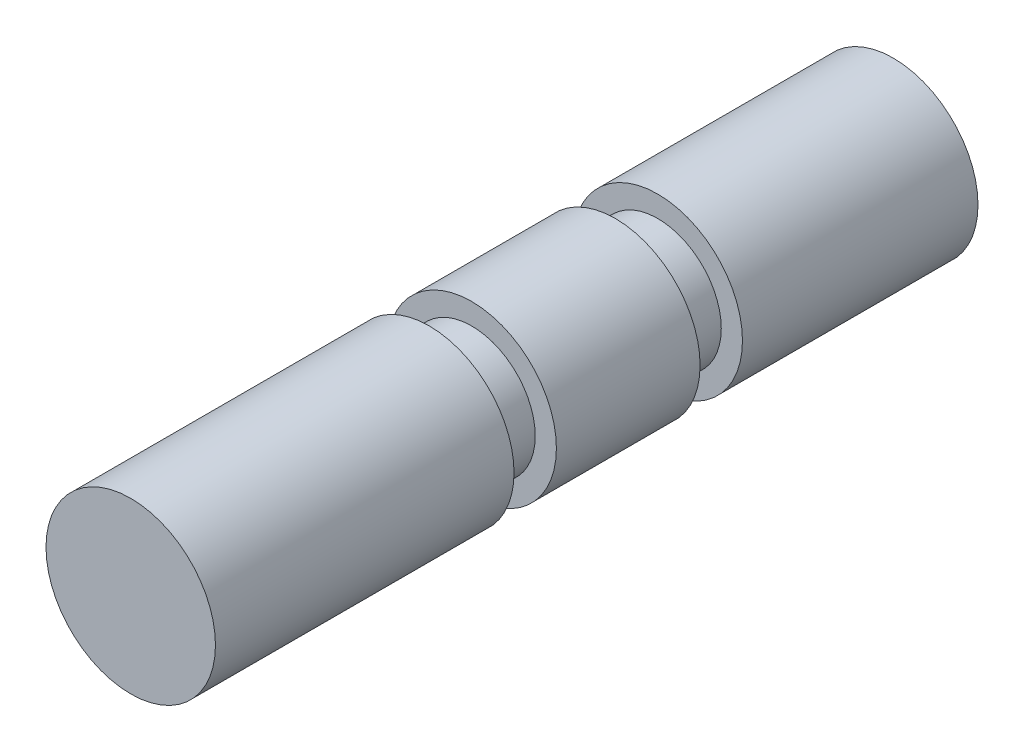
ISO-10303-21;
HEADER;
FILE_DESCRIPTION(('STEP AP214'),'2;1');
FILE_NAME('part.step','',(''),(''),'','','');
FILE_SCHEMA(('AUTOMOTIVE_DESIGN { 1 0 10303 214 1 1 1 1 }'));
ENDSEC;
DATA;
#1=APPLICATION_CONTEXT('core data for automotive mechanical design processes');
#2=APPLICATION_PROTOCOL_DEFINITION('international standard','automotive_design',2000,#1);
#3=PRODUCT_CONTEXT('',#1,'mechanical');
#4=PRODUCT('Part','Part','',(#3));
#5=PRODUCT_RELATED_PRODUCT_CATEGORY('part','',(#4));
#6=PRODUCT_DEFINITION_FORMATION('','',#4);
#7=PRODUCT_DEFINITION_CONTEXT('part definition',#1,'design');
#8=PRODUCT_DEFINITION('design','',#6,#7);
#9=PRODUCT_DEFINITION_SHAPE('','',#8);
#10=(LENGTH_UNIT() NAMED_UNIT(*) SI_UNIT(.MILLI.,.METRE.));
#11=(NAMED_UNIT(*) PLANE_ANGLE_UNIT() SI_UNIT($,.RADIAN.));
#12=(NAMED_UNIT(*) SI_UNIT($,.STERADIAN.) SOLID_ANGLE_UNIT());
#13=UNCERTAINTY_MEASURE_WITH_UNIT(LENGTH_MEASURE(1.E-05),#10,'distance_accuracy_value','');
#14=(GEOMETRIC_REPRESENTATION_CONTEXT(3) GLOBAL_UNCERTAINTY_ASSIGNED_CONTEXT((#13)) GLOBAL_UNIT_ASSIGNED_CONTEXT((#10,
#11,#12)) REPRESENTATION_CONTEXT('',''));
#15=CARTESIAN_POINT('',(0.,0.,0.));
#16=DIRECTION('',(0.,0.,1.));
#17=DIRECTION('',(1.,0.,0.));
#18=AXIS2_PLACEMENT_3D('',#15,#16,#17);
#19=CARTESIAN_POINT('',(0.,0.,0.));
#20=DIRECTION('',(0.,0.,1.));
#21=DIRECTION('',(1.,0.,0.));
#22=AXIS2_PLACEMENT_3D('',#19,#20,#21);
#23=CYLINDRICAL_SURFACE('',#22,50.);
#24=CARTESIAN_POINT('',(0.,0.,-426.2));
#25=DIRECTION('',(0.,0.,1.));
#26=DIRECTION('',(1.,0.,0.));
#27=AXIS2_PLACEMENT_3D('',#24,#25,#26);
#28=CIRCLE('',#27,50.);
#29=CARTESIAN_POINT('',(50.,0.,-426.2));
#30=VERTEX_POINT('',#29);
#31=EDGE_CURVE('E63',#30,#30,#28,.T.);
#32=ORIENTED_EDGE('',*,*,#31,.T.);
#33=EDGE_LOOP('',(#32));
#34=FACE_BOUND('',#33,.T.);
#35=CARTESIAN_POINT('',(0.,0.,-250.));
#36=DIRECTION('',(0.,0.,1.));
#37=DIRECTION('',(1.,0.,0.));
#38=AXIS2_PLACEMENT_3D('',#35,#36,#37);
#39=CIRCLE('',#38,50.);
#40=CARTESIAN_POINT('',(50.,0.,-250.));
#41=VERTEX_POINT('',#40);
#42=EDGE_CURVE('E66',#41,#41,#39,.T.);
#43=ORIENTED_EDGE('',*,*,#42,.F.);
#44=EDGE_LOOP('',(#43));
#45=FACE_BOUND('',#44,.T.);
#46=ADVANCED_FACE('F31',(#34,#45),#23,.T.);
#47=CARTESIAN_POINT('',(0.,0.,-700.));
#48=DIRECTION('',(0.,0.,1.));
#49=DIRECTION('',(1.,0.,0.));
#50=AXIS2_PLACEMENT_3D('',#47,#48,#49);
#51=PLANE('',#50);
#52=CARTESIAN_POINT('',(0.,0.,-700.));
#53=DIRECTION('',(0.,0.,1.));
#54=DIRECTION('',(1.,0.,0.));
#55=AXIS2_PLACEMENT_3D('',#52,#53,#54);
#56=CIRCLE('',#55,50.);
#57=CARTESIAN_POINT('',(50.,0.,-700.));
#58=VERTEX_POINT('',#57);
#59=EDGE_CURVE('E10',#58,#58,#56,.T.);
#60=ORIENTED_EDGE('',*,*,#59,.F.);
#61=EDGE_LOOP('',(#60));
#62=FACE_BOUND('',#61,.T.);
#63=ADVANCED_FACE('F33',(#62),#51,.F.);
#64=CARTESIAN_POINT('',(0.,0.,0.));
#65=DIRECTION('',(0.,0.,1.));
#66=DIRECTION('',(1.,0.,0.));
#67=AXIS2_PLACEMENT_3D('',#64,#65,#66);
#68=CYLINDRICAL_SURFACE('',#67,50.);
#69=CARTESIAN_POINT('',(0.,0.,-561.));
#70=DIRECTION('',(0.,0.,1.));
#71=DIRECTION('',(1.,0.,0.));
#72=AXIS2_PLACEMENT_3D('',#69,#70,#71);
#73=CIRCLE('',#72,50.);
#74=CARTESIAN_POINT('',(50.,0.,-561.));
#75=VERTEX_POINT('',#74);
#76=EDGE_CURVE('E38',#75,#75,#73,.T.);
#77=ORIENTED_EDGE('',*,*,#76,.F.);
#78=EDGE_LOOP('',(#77));
#79=FACE_BOUND('',#78,.T.);
#80=ORIENTED_EDGE('',*,*,#59,.T.);
#81=EDGE_LOOP('',(#80));
#82=FACE_BOUND('',#81,.T.);
#83=ADVANCED_FACE('F80',(#79,#82),#68,.T.);
#84=CARTESIAN_POINT('',(0.,50.,-561.));
#85=DIRECTION('',(0.,0.,-1.));
#86=DIRECTION('',(-1.,0.,0.));
#87=AXIS2_PLACEMENT_3D('',#84,#85,#86);
#88=PLANE('',#87);
#89=CARTESIAN_POINT('',(0.,0.,-561.));
#90=DIRECTION('',(0.,0.,1.));
#91=DIRECTION('',(1.,0.,0.));
#92=AXIS2_PLACEMENT_3D('',#89,#90,#91);
#93=CIRCLE('',#92,37.5);
#94=CARTESIAN_POINT('',(37.5,0.,-561.));
#95=VERTEX_POINT('',#94);
#96=EDGE_CURVE('E42',#95,#95,#93,.T.);
#97=ORIENTED_EDGE('',*,*,#96,.F.);
#98=EDGE_LOOP('',(#97));
#99=FACE_BOUND('',#98,.T.);
#100=ORIENTED_EDGE('',*,*,#76,.T.);
#101=EDGE_LOOP('',(#100));
#102=FACE_BOUND('',#101,.T.);
#103=ADVANCED_FACE('F107',(#99,#102),#88,.F.);
#104=CARTESIAN_POINT('',(0.,0.,0.));
#105=DIRECTION('',(0.,0.,1.));
#106=DIRECTION('',(1.,0.,0.));
#107=AXIS2_PLACEMENT_3D('',#104,#105,#106);
#108=CYLINDRICAL_SURFACE('',#107,37.5);
#109=CARTESIAN_POINT('',(0.,0.,-536.));
#110=DIRECTION('',(0.,0.,1.));
#111=DIRECTION('',(1.,0.,0.));
#112=AXIS2_PLACEMENT_3D('',#109,#110,#111);
#113=CIRCLE('',#112,37.5);
#114=CARTESIAN_POINT('',(37.5,0.,-536.));
#115=VERTEX_POINT('',#114);
#116=EDGE_CURVE('E46',#115,#115,#113,.T.);
#117=ORIENTED_EDGE('',*,*,#116,.F.);
#118=EDGE_LOOP('',(#117));
#119=FACE_BOUND('',#118,.T.);
#120=ORIENTED_EDGE('',*,*,#96,.T.);
#121=EDGE_LOOP('',(#120));
#122=FACE_BOUND('',#121,.T.);
#123=ADVANCED_FACE('F103',(#119,#122),#108,.T.);
#124=CARTESIAN_POINT('',(0.,37.5,-536.));
#125=DIRECTION('',(0.,0.,1.));
#126=DIRECTION('',(1.,0.,0.));
#127=AXIS2_PLACEMENT_3D('',#124,#125,#126);
#128=PLANE('',#127);
#129=CARTESIAN_POINT('',(0.,0.,-536.));
#130=DIRECTION('',(0.,0.,1.));
#131=DIRECTION('',(1.,0.,0.));
#132=AXIS2_PLACEMENT_3D('',#129,#130,#131);
#133=CIRCLE('',#132,50.);
#134=CARTESIAN_POINT('',(50.,0.,-536.));
#135=VERTEX_POINT('',#134);
#136=EDGE_CURVE('E51',#135,#135,#133,.T.);
#137=ORIENTED_EDGE('',*,*,#136,.F.);
#138=EDGE_LOOP('',(#137));
#139=FACE_BOUND('',#138,.T.);
#140=ORIENTED_EDGE('',*,*,#116,.T.);
#141=EDGE_LOOP('',(#140));
#142=FACE_BOUND('',#141,.T.);
#143=ADVANCED_FACE('F99',(#139,#142),#128,.F.);
#144=CARTESIAN_POINT('',(0.,0.,0.));
#145=DIRECTION('',(0.,0.,1.));
#146=DIRECTION('',(1.,0.,0.));
#147=AXIS2_PLACEMENT_3D('',#144,#145,#146);
#148=CYLINDRICAL_SURFACE('',#147,50.);
#149=CARTESIAN_POINT('',(0.,0.,-451.2));
#150=DIRECTION('',(0.,0.,1.));
#151=DIRECTION('',(1.,0.,0.));
#152=AXIS2_PLACEMENT_3D('',#149,#150,#151);
#153=CIRCLE('',#152,50.);
#154=CARTESIAN_POINT('',(50.,0.,-451.2));
#155=VERTEX_POINT('',#154);
#156=EDGE_CURVE('E54',#155,#155,#153,.T.);
#157=ORIENTED_EDGE('',*,*,#156,.F.);
#158=EDGE_LOOP('',(#157));
#159=FACE_BOUND('',#158,.T.);
#160=ORIENTED_EDGE('',*,*,#136,.T.);
#161=EDGE_LOOP('',(#160));
#162=FACE_BOUND('',#161,.T.);
#163=ADVANCED_FACE('F95',(#159,#162),#148,.T.);
#164=CARTESIAN_POINT('',(0.,50.,-451.2));
#165=DIRECTION('',(0.,0.,-1.));
#166=DIRECTION('',(-1.,0.,0.));
#167=AXIS2_PLACEMENT_3D('',#164,#165,#166);
#168=PLANE('',#167);
#169=CARTESIAN_POINT('',(0.,0.,-451.2));
#170=DIRECTION('',(0.,0.,1.));
#171=DIRECTION('',(1.,0.,0.));
#172=AXIS2_PLACEMENT_3D('',#169,#170,#171);
#173=CIRCLE('',#172,37.5);
#174=CARTESIAN_POINT('',(37.5,0.,-451.2));
#175=VERTEX_POINT('',#174);
#176=EDGE_CURVE('E57',#175,#175,#173,.T.);
#177=ORIENTED_EDGE('',*,*,#176,.F.);
#178=EDGE_LOOP('',(#177));
#179=FACE_BOUND('',#178,.T.);
#180=ORIENTED_EDGE('',*,*,#156,.T.);
#181=EDGE_LOOP('',(#180));
#182=FACE_BOUND('',#181,.T.);
#183=ADVANCED_FACE('F91',(#179,#182),#168,.F.);
#184=CARTESIAN_POINT('',(0.,0.,0.));
#185=DIRECTION('',(0.,0.,1.));
#186=DIRECTION('',(1.,0.,0.));
#187=AXIS2_PLACEMENT_3D('',#184,#185,#186);
#188=CYLINDRICAL_SURFACE('',#187,37.5);
#189=CARTESIAN_POINT('',(0.,0.,-426.2));
#190=DIRECTION('',(0.,0.,1.));
#191=DIRECTION('',(1.,0.,0.));
#192=AXIS2_PLACEMENT_3D('',#189,#190,#191);
#193=CIRCLE('',#192,37.5);
#194=CARTESIAN_POINT('',(37.5,0.,-426.2));
#195=VERTEX_POINT('',#194);
#196=EDGE_CURVE('E60',#195,#195,#193,.T.);
#197=ORIENTED_EDGE('',*,*,#196,.F.);
#198=EDGE_LOOP('',(#197));
#199=FACE_BOUND('',#198,.T.);
#200=ORIENTED_EDGE('',*,*,#176,.T.);
#201=EDGE_LOOP('',(#200));
#202=FACE_BOUND('',#201,.T.);
#203=ADVANCED_FACE('F87',(#199,#202),#188,.T.);
#204=CARTESIAN_POINT('',(0.,37.5,-426.2));
#205=DIRECTION('',(0.,0.,1.));
#206=DIRECTION('',(1.,0.,0.));
#207=AXIS2_PLACEMENT_3D('',#204,#205,#206);
#208=PLANE('',#207);
#209=ORIENTED_EDGE('',*,*,#31,.F.);
#210=EDGE_LOOP('',(#209));
#211=FACE_BOUND('',#210,.T.);
#212=ORIENTED_EDGE('',*,*,#196,.T.);
#213=EDGE_LOOP('',(#212));
#214=FACE_BOUND('',#213,.T.);
#215=ADVANCED_FACE('F84',(#211,#214),#208,.F.);
#216=CARTESIAN_POINT('',(0.,0.,-250.));
#217=DIRECTION('',(0.,0.,1.));
#218=DIRECTION('',(1.,0.,0.));
#219=AXIS2_PLACEMENT_3D('',#216,#217,#218);
#220=PLANE('',#219);
#221=ORIENTED_EDGE('',*,*,#42,.T.);
#222=EDGE_LOOP('',(#221));
#223=FACE_BOUND('',#222,.T.);
#224=ADVANCED_FACE('F70',(#223),#220,.T.);
#225=CLOSED_SHELL('',(#46,#63,#83,#103,#123,#143,#163,#183,#203,#215,#224));
#226=MANIFOLD_SOLID_BREP('B2',#225);
#227=ADVANCED_BREP_SHAPE_REPRESENTATION('',(#18,#226),#14);
#228=SHAPE_DEFINITION_REPRESENTATION(#9,#227);
ENDSEC;
END-ISO-10303-21;
